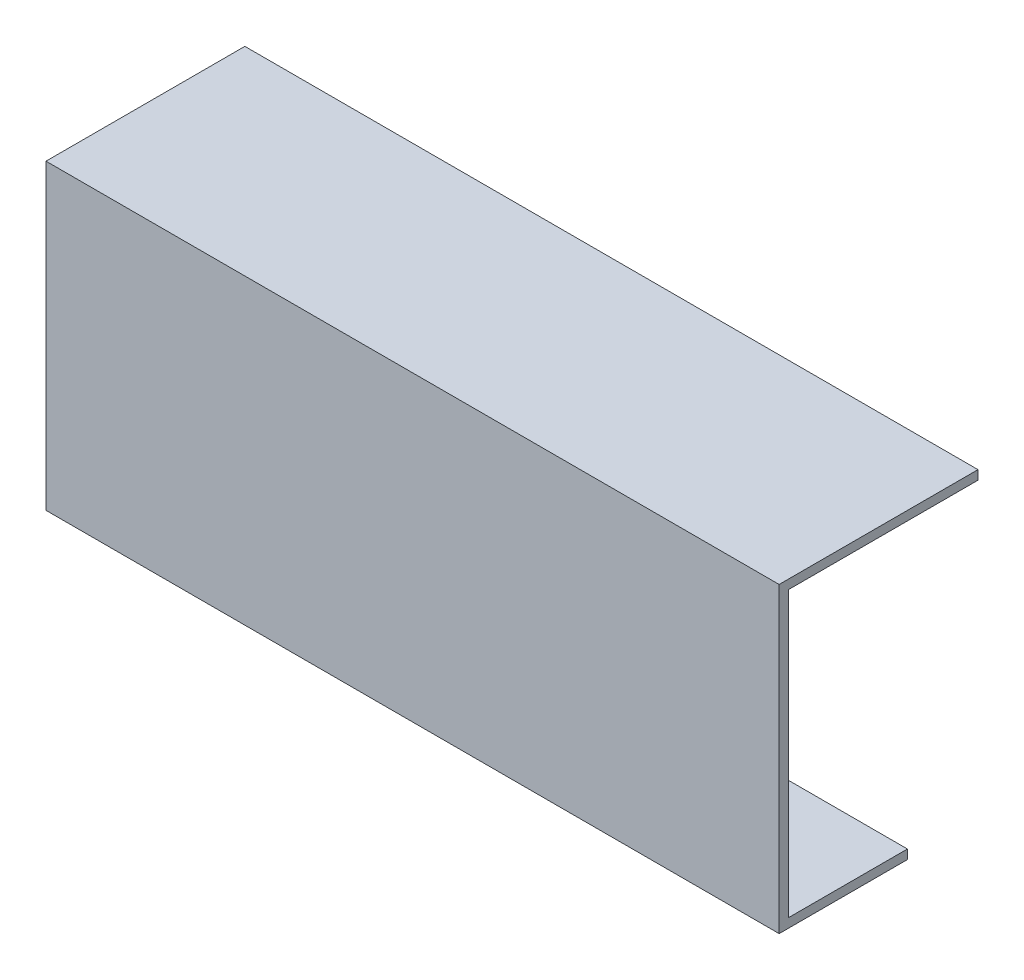
ISO-10303-21;
HEADER;
FILE_DESCRIPTION(('STEP AP214'),'2;1');
FILE_NAME('part.step','',(''),(''),'','','');
FILE_SCHEMA(('AUTOMOTIVE_DESIGN { 1 0 10303 214 1 1 1 1 }'));
ENDSEC;
DATA;
#1=APPLICATION_CONTEXT('core data for automotive mechanical design processes');
#2=APPLICATION_PROTOCOL_DEFINITION('international standard','automotive_design',2000,#1);
#3=PRODUCT_CONTEXT('',#1,'mechanical');
#4=PRODUCT('Part','Part','',(#3));
#5=PRODUCT_RELATED_PRODUCT_CATEGORY('part','',(#4));
#6=PRODUCT_DEFINITION_FORMATION('','',#4);
#7=PRODUCT_DEFINITION_CONTEXT('part definition',#1,'design');
#8=PRODUCT_DEFINITION('design','',#6,#7);
#9=PRODUCT_DEFINITION_SHAPE('','',#8);
#10=(LENGTH_UNIT() NAMED_UNIT(*) SI_UNIT(.MILLI.,.METRE.));
#11=(NAMED_UNIT(*) PLANE_ANGLE_UNIT() SI_UNIT($,.RADIAN.));
#12=(NAMED_UNIT(*) SI_UNIT($,.STERADIAN.) SOLID_ANGLE_UNIT());
#13=UNCERTAINTY_MEASURE_WITH_UNIT(LENGTH_MEASURE(1.E-05),#10,'distance_accuracy_value','');
#14=(GEOMETRIC_REPRESENTATION_CONTEXT(3) GLOBAL_UNCERTAINTY_ASSIGNED_CONTEXT((#13)) GLOBAL_UNIT_ASSIGNED_CONTEXT((#10,
#11,#12)) REPRESENTATION_CONTEXT('',''));
#15=CARTESIAN_POINT('',(0.,0.,0.));
#16=DIRECTION('',(0.,0.,1.));
#17=DIRECTION('',(1.,0.,0.));
#18=AXIS2_PLACEMENT_3D('',#15,#16,#17);
#19=CARTESIAN_POINT('',(0.,0.,55.118));
#20=DIRECTION('',(1.,0.,0.));
#21=DIRECTION('',(0.,0.,-1.));
#22=AXIS2_PLACEMENT_3D('',#19,#20,#21);
#23=PLANE('',#22);
#24=DIRECTION('',(0.,0.,-1.));
#25=VECTOR('',#24,1.);
#26=CARTESIAN_POINT('',(0.,-81.28,19.558));
#27=LINE('',#26,#25);
#28=CARTESIAN_POINT('',(0.,-81.28,52.578));
#29=VERTEX_POINT('',#28);
#30=CARTESIAN_POINT('',(0.,-81.28,19.558));
#31=VERTEX_POINT('',#30);
#32=EDGE_CURVE('E130',#29,#31,#27,.T.);
#33=ORIENTED_EDGE('',*,*,#32,.T.);
#34=DIRECTION('',(0.,-1.,0.));
#35=VECTOR('',#34,1.);
#36=CARTESIAN_POINT('',(0.,-83.82,19.558));
#37=LINE('',#36,#35);
#38=CARTESIAN_POINT('',(0.,-83.82,19.558));
#39=VERTEX_POINT('',#38);
#40=EDGE_CURVE('E144',#31,#39,#37,.T.);
#41=ORIENTED_EDGE('',*,*,#40,.T.);
#42=DIRECTION('',(0.,0.,-1.));
#43=VECTOR('',#42,1.);
#44=CARTESIAN_POINT('',(0.,-83.82,55.118));
#45=LINE('',#44,#43);
#46=CARTESIAN_POINT('',(0.,-83.82,55.118));
#47=VERTEX_POINT('',#46);
#48=EDGE_CURVE('E11',#47,#39,#45,.T.);
#49=ORIENTED_EDGE('',*,*,#48,.F.);
#50=DIRECTION('',(0.,-1.,0.));
#51=VECTOR('',#50,1.);
#52=CARTESIAN_POINT('',(0.,0.,55.118));
#53=LINE('',#52,#51);
#54=CARTESIAN_POINT('',(0.,0.,55.118));
#55=VERTEX_POINT('',#54);
#56=EDGE_CURVE('E167',#55,#47,#53,.T.);
#57=ORIENTED_EDGE('',*,*,#56,.F.);
#58=DIRECTION('',(0.,0.,-1.));
#59=VECTOR('',#58,1.);
#60=CARTESIAN_POINT('',(0.,0.,55.118));
#61=LINE('',#60,#59);
#62=CARTESIAN_POINT('',(0.,0.,0.));
#63=VERTEX_POINT('',#62);
#64=EDGE_CURVE('E177',#55,#63,#61,.T.);
#65=ORIENTED_EDGE('',*,*,#64,.T.);
#66=DIRECTION('',(0.,-1.,0.));
#67=VECTOR('',#66,1.);
#68=CARTESIAN_POINT('',(0.,0.,0.));
#69=LINE('',#68,#67);
#70=CARTESIAN_POINT('',(0.,-2.54,0.));
#71=VERTEX_POINT('',#70);
#72=EDGE_CURVE('E134',#63,#71,#69,.T.);
#73=ORIENTED_EDGE('',*,*,#72,.T.);
#74=DIRECTION('',(0.,0.,1.));
#75=VECTOR('',#74,1.);
#76=CARTESIAN_POINT('',(0.,-2.54,52.578));
#77=LINE('',#76,#75);
#78=CARTESIAN_POINT('',(0.,-2.54,52.578));
#79=VERTEX_POINT('',#78);
#80=EDGE_CURVE('E54',#71,#79,#77,.T.);
#81=ORIENTED_EDGE('',*,*,#80,.T.);
#82=DIRECTION('',(0.,-1.,0.));
#83=VECTOR('',#82,1.);
#84=CARTESIAN_POINT('',(0.,-81.28,52.578));
#85=LINE('',#84,#83);
#86=EDGE_CURVE('E124',#79,#29,#85,.T.);
#87=ORIENTED_EDGE('',*,*,#86,.T.);
#88=EDGE_LOOP('',(#33,#41,#49,#57,#65,#73,#81,#87));
#89=FACE_BOUND('',#88,.T.);
#90=ADVANCED_FACE('F39',(#89),#23,.F.);
#91=CARTESIAN_POINT('',(0.,-83.82,55.118));
#92=DIRECTION('',(0.,1.,0.));
#93=DIRECTION('',(0.,0.,1.));
#94=AXIS2_PLACEMENT_3D('',#91,#92,#93);
#95=PLANE('',#94);
#96=ORIENTED_EDGE('',*,*,#48,.T.);
#97=DIRECTION('',(1.,0.,0.));
#98=VECTOR('',#97,1.);
#99=CARTESIAN_POINT('',(0.,-83.82,19.558));
#100=LINE('',#99,#98);
#101=CARTESIAN_POINT('',(203.2,-83.82,19.558));
#102=VERTEX_POINT('',#101);
#103=EDGE_CURVE('E156',#39,#102,#100,.T.);
#104=ORIENTED_EDGE('',*,*,#103,.T.);
#105=DIRECTION('',(0.,0.,-1.));
#106=VECTOR('',#105,1.);
#107=CARTESIAN_POINT('',(203.2,-83.82,55.118));
#108=LINE('',#107,#106);
#109=CARTESIAN_POINT('',(203.2,-83.82,55.118));
#110=VERTEX_POINT('',#109);
#111=EDGE_CURVE('E47',#110,#102,#108,.T.);
#112=ORIENTED_EDGE('',*,*,#111,.F.);
#113=DIRECTION('',(1.,0.,0.));
#114=VECTOR('',#113,1.);
#115=CARTESIAN_POINT('',(0.,-83.82,55.118));
#116=LINE('',#115,#114);
#117=EDGE_CURVE('E85',#47,#110,#116,.T.);
#118=ORIENTED_EDGE('',*,*,#117,.F.);
#119=EDGE_LOOP('',(#96,#104,#112,#118));
#120=FACE_BOUND('',#119,.T.);
#121=ADVANCED_FACE('F197',(#120),#95,.F.);
#122=CARTESIAN_POINT('',(203.2,0.,55.118));
#123=DIRECTION('',(-1.,0.,0.));
#124=DIRECTION('',(0.,0.,1.));
#125=AXIS2_PLACEMENT_3D('',#122,#123,#124);
#126=PLANE('',#125);
#127=ORIENTED_EDGE('',*,*,#111,.T.);
#128=DIRECTION('',(0.,-1.,0.));
#129=VECTOR('',#128,1.);
#130=CARTESIAN_POINT('',(203.2,-83.82,19.558));
#131=LINE('',#130,#129);
#132=CARTESIAN_POINT('',(203.2,-81.28,19.558));
#133=VERTEX_POINT('',#132);
#134=EDGE_CURVE('E136',#133,#102,#131,.T.);
#135=ORIENTED_EDGE('',*,*,#134,.F.);
#136=DIRECTION('',(0.,0.,-1.));
#137=VECTOR('',#136,1.);
#138=CARTESIAN_POINT('',(203.2,-81.28,19.558));
#139=LINE('',#138,#137);
#140=CARTESIAN_POINT('',(203.2,-81.28,52.578));
#141=VERTEX_POINT('',#140);
#142=EDGE_CURVE('E139',#141,#133,#139,.T.);
#143=ORIENTED_EDGE('',*,*,#142,.F.);
#144=DIRECTION('',(0.,-1.,0.));
#145=VECTOR('',#144,1.);
#146=CARTESIAN_POINT('',(203.2,-81.28,52.578));
#147=LINE('',#146,#145);
#148=CARTESIAN_POINT('',(203.2,-2.54,52.578));
#149=VERTEX_POINT('',#148);
#150=EDGE_CURVE('E150',#149,#141,#147,.T.);
#151=ORIENTED_EDGE('',*,*,#150,.F.);
#152=DIRECTION('',(0.,0.,1.));
#153=VECTOR('',#152,1.);
#154=CARTESIAN_POINT('',(203.2,-2.54,52.578));
#155=LINE('',#154,#153);
#156=CARTESIAN_POINT('',(203.2,-2.54,0.));
#157=VERTEX_POINT('',#156);
#158=EDGE_CURVE('E115',#157,#149,#155,.T.);
#159=ORIENTED_EDGE('',*,*,#158,.F.);
#160=DIRECTION('',(0.,1.,0.));
#161=VECTOR('',#160,1.);
#162=CARTESIAN_POINT('',(203.2,0.,0.));
#163=LINE('',#162,#161);
#164=CARTESIAN_POINT('',(203.2,0.,0.));
#165=VERTEX_POINT('',#164);
#166=EDGE_CURVE('E180',#157,#165,#163,.T.);
#167=ORIENTED_EDGE('',*,*,#166,.T.);
#168=DIRECTION('',(0.,0.,-1.));
#169=VECTOR('',#168,1.);
#170=CARTESIAN_POINT('',(203.2,0.,55.118));
#171=LINE('',#170,#169);
#172=CARTESIAN_POINT('',(203.2,0.,55.118));
#173=VERTEX_POINT('',#172);
#174=EDGE_CURVE('E187',#173,#165,#171,.T.);
#175=ORIENTED_EDGE('',*,*,#174,.F.);
#176=DIRECTION('',(0.,1.,0.));
#177=VECTOR('',#176,1.);
#178=CARTESIAN_POINT('',(203.2,0.,55.118));
#179=LINE('',#178,#177);
#180=EDGE_CURVE('E172',#110,#173,#179,.T.);
#181=ORIENTED_EDGE('',*,*,#180,.F.);
#182=EDGE_LOOP('',(#127,#135,#143,#151,#159,#167,#175,#181));
#183=FACE_BOUND('',#182,.T.);
#184=ADVANCED_FACE('F194',(#183),#126,.F.);
#185=CARTESIAN_POINT('',(0.,0.,55.118));
#186=DIRECTION('',(0.,-1.,0.));
#187=DIRECTION('',(0.,0.,-1.));
#188=AXIS2_PLACEMENT_3D('',#185,#186,#187);
#189=PLANE('',#188);
#190=DIRECTION('',(-1.,0.,0.));
#191=VECTOR('',#190,1.);
#192=CARTESIAN_POINT('',(0.,0.,0.));
#193=LINE('',#192,#191);
#194=EDGE_CURVE('E78',#165,#63,#193,.T.);
#195=ORIENTED_EDGE('',*,*,#194,.T.);
#196=ORIENTED_EDGE('',*,*,#64,.F.);
#197=DIRECTION('',(-1.,0.,0.));
#198=VECTOR('',#197,1.);
#199=CARTESIAN_POINT('',(0.,0.,55.118));
#200=LINE('',#199,#198);
#201=EDGE_CURVE('E63',#173,#55,#200,.T.);
#202=ORIENTED_EDGE('',*,*,#201,.F.);
#203=ORIENTED_EDGE('',*,*,#174,.T.);
#204=EDGE_LOOP('',(#195,#196,#202,#203));
#205=FACE_BOUND('',#204,.T.);
#206=ADVANCED_FACE('F216',(#205),#189,.F.);
#207=CARTESIAN_POINT('',(0.,0.,55.118));
#208=DIRECTION('',(0.,0.,1.));
#209=DIRECTION('',(1.,0.,0.));
#210=AXIS2_PLACEMENT_3D('',#207,#208,#209);
#211=PLANE('',#210);
#212=ORIENTED_EDGE('',*,*,#56,.T.);
#213=ORIENTED_EDGE('',*,*,#117,.T.);
#214=ORIENTED_EDGE('',*,*,#180,.T.);
#215=ORIENTED_EDGE('',*,*,#201,.T.);
#216=EDGE_LOOP('',(#212,#213,#214,#215));
#217=FACE_BOUND('',#216,.T.);
#218=ADVANCED_FACE('F209',(#217),#211,.T.);
#219=CARTESIAN_POINT('',(0.,0.,0.));
#220=DIRECTION('',(0.,0.,1.));
#221=DIRECTION('',(1.,0.,0.));
#222=AXIS2_PLACEMENT_3D('',#219,#220,#221);
#223=PLANE('',#222);
#224=ORIENTED_EDGE('',*,*,#166,.F.);
#225=DIRECTION('',(1.,0.,0.));
#226=VECTOR('',#225,1.);
#227=CARTESIAN_POINT('',(0.,-2.54,0.));
#228=LINE('',#227,#226);
#229=EDGE_CURVE('E121',#71,#157,#228,.T.);
#230=ORIENTED_EDGE('',*,*,#229,.F.);
#231=ORIENTED_EDGE('',*,*,#72,.F.);
#232=ORIENTED_EDGE('',*,*,#194,.F.);
#233=EDGE_LOOP('',(#224,#230,#231,#232));
#234=FACE_BOUND('',#233,.T.);
#235=ADVANCED_FACE('F207',(#234),#223,.F.);
#236=CARTESIAN_POINT('',(0.,-83.82,19.558));
#237=DIRECTION('',(0.,0.,1.));
#238=DIRECTION('',(1.,0.,0.));
#239=AXIS2_PLACEMENT_3D('',#236,#237,#238);
#240=PLANE('',#239);
#241=ORIENTED_EDGE('',*,*,#134,.T.);
#242=ORIENTED_EDGE('',*,*,#103,.F.);
#243=ORIENTED_EDGE('',*,*,#40,.F.);
#244=DIRECTION('',(1.,0.,0.));
#245=VECTOR('',#244,1.);
#246=CARTESIAN_POINT('',(0.,-81.28,19.558));
#247=LINE('',#246,#245);
#248=EDGE_CURVE('E160',#31,#133,#247,.T.);
#249=ORIENTED_EDGE('',*,*,#248,.T.);
#250=EDGE_LOOP('',(#241,#242,#243,#249));
#251=FACE_BOUND('',#250,.T.);
#252=ADVANCED_FACE('F201',(#251),#240,.F.);
#253=CARTESIAN_POINT('',(0.,-81.28,19.558));
#254=DIRECTION('',(0.,-1.,0.));
#255=DIRECTION('',(0.,0.,-1.));
#256=AXIS2_PLACEMENT_3D('',#253,#254,#255);
#257=PLANE('',#256);
#258=ORIENTED_EDGE('',*,*,#142,.T.);
#259=ORIENTED_EDGE('',*,*,#248,.F.);
#260=ORIENTED_EDGE('',*,*,#32,.F.);
#261=DIRECTION('',(1.,0.,0.));
#262=VECTOR('',#261,1.);
#263=CARTESIAN_POINT('',(0.,-81.28,52.578));
#264=LINE('',#263,#262);
#265=EDGE_CURVE('E120',#29,#141,#264,.T.);
#266=ORIENTED_EDGE('',*,*,#265,.T.);
#267=EDGE_LOOP('',(#258,#259,#260,#266));
#268=FACE_BOUND('',#267,.T.);
#269=ADVANCED_FACE('F204',(#268),#257,.F.);
#270=CARTESIAN_POINT('',(0.,-81.28,52.578));
#271=DIRECTION('',(0.,0.,1.));
#272=DIRECTION('',(1.,0.,0.));
#273=AXIS2_PLACEMENT_3D('',#270,#271,#272);
#274=PLANE('',#273);
#275=ORIENTED_EDGE('',*,*,#150,.T.);
#276=ORIENTED_EDGE('',*,*,#265,.F.);
#277=ORIENTED_EDGE('',*,*,#86,.F.);
#278=DIRECTION('',(1.,0.,0.));
#279=VECTOR('',#278,1.);
#280=CARTESIAN_POINT('',(0.,-2.54,52.578));
#281=LINE('',#280,#279);
#282=EDGE_CURVE('E111',#79,#149,#281,.T.);
#283=ORIENTED_EDGE('',*,*,#282,.T.);
#284=EDGE_LOOP('',(#275,#276,#277,#283));
#285=FACE_BOUND('',#284,.T.);
#286=ADVANCED_FACE('F125',(#285),#274,.F.);
#287=CARTESIAN_POINT('',(0.,-2.54,52.578));
#288=DIRECTION('',(0.,1.,0.));
#289=DIRECTION('',(0.,0.,1.));
#290=AXIS2_PLACEMENT_3D('',#287,#288,#289);
#291=PLANE('',#290);
#292=ORIENTED_EDGE('',*,*,#158,.T.);
#293=ORIENTED_EDGE('',*,*,#282,.F.);
#294=ORIENTED_EDGE('',*,*,#80,.F.);
#295=ORIENTED_EDGE('',*,*,#229,.T.);
#296=EDGE_LOOP('',(#292,#293,#294,#295));
#297=FACE_BOUND('',#296,.T.);
#298=ADVANCED_FACE('F113',(#297),#291,.F.);
#299=CLOSED_SHELL('',(#90,#121,#184,#206,#218,#235,#252,#269,#286,#298));
#300=MANIFOLD_SOLID_BREP('B2',#299);
#301=ADVANCED_BREP_SHAPE_REPRESENTATION('',(#18,#300),#14);
#302=SHAPE_DEFINITION_REPRESENTATION(#9,#301);
ENDSEC;
END-ISO-10303-21;
